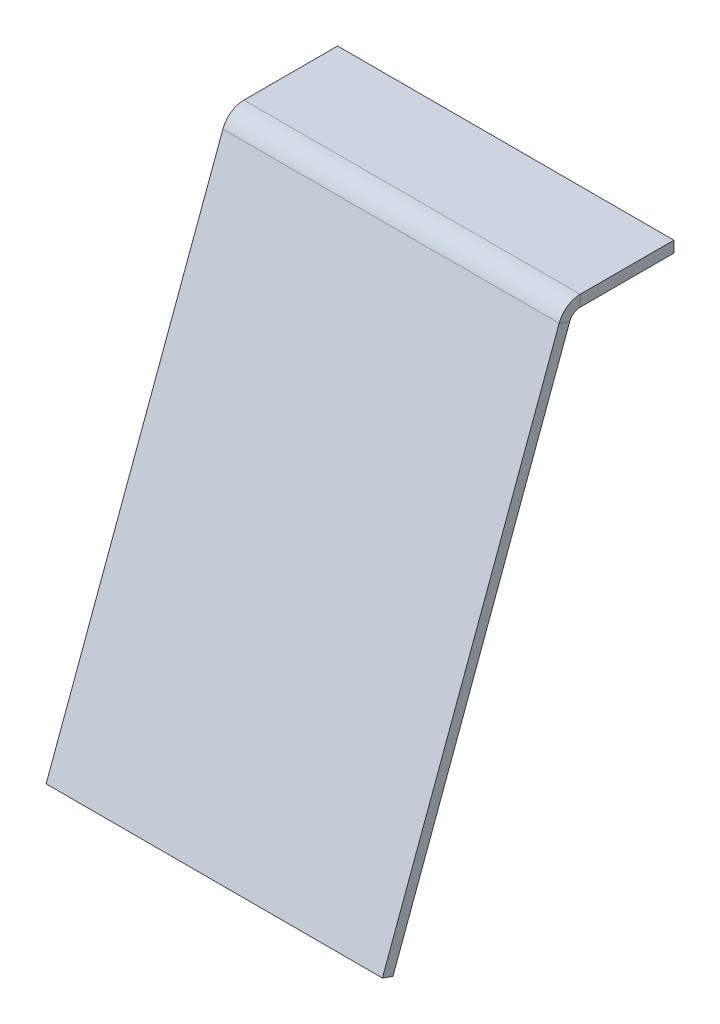
ISO-10303-21;
HEADER;
FILE_DESCRIPTION(('STEP AP214'),'2;1');
FILE_NAME('part.step','',(''),(''),'','','');
FILE_SCHEMA(('AUTOMOTIVE_DESIGN { 1 0 10303 214 1 1 1 1 }'));
ENDSEC;
DATA;
#1=APPLICATION_CONTEXT('core data for automotive mechanical design processes');
#2=APPLICATION_PROTOCOL_DEFINITION('international standard','automotive_design',2000,#1);
#3=PRODUCT_CONTEXT('',#1,'mechanical');
#4=PRODUCT('Part','Part','',(#3));
#5=PRODUCT_RELATED_PRODUCT_CATEGORY('part','',(#4));
#6=PRODUCT_DEFINITION_FORMATION('','',#4);
#7=PRODUCT_DEFINITION_CONTEXT('part definition',#1,'design');
#8=PRODUCT_DEFINITION('design','',#6,#7);
#9=PRODUCT_DEFINITION_SHAPE('','',#8);
#10=(LENGTH_UNIT() NAMED_UNIT(*) SI_UNIT(.MILLI.,.METRE.));
#11=(NAMED_UNIT(*) PLANE_ANGLE_UNIT() SI_UNIT($,.RADIAN.));
#12=(NAMED_UNIT(*) SI_UNIT($,.STERADIAN.) SOLID_ANGLE_UNIT());
#13=UNCERTAINTY_MEASURE_WITH_UNIT(LENGTH_MEASURE(1.E-05),#10,'distance_accuracy_value','');
#14=(GEOMETRIC_REPRESENTATION_CONTEXT(3) GLOBAL_UNCERTAINTY_ASSIGNED_CONTEXT((#13)) GLOBAL_UNIT_ASSIGNED_CONTEXT((#10,
#11,#12)) REPRESENTATION_CONTEXT('',''));
#15=CARTESIAN_POINT('',(0.,0.,0.));
#16=DIRECTION('',(0.,0.,1.));
#17=DIRECTION('',(1.,0.,0.));
#18=AXIS2_PLACEMENT_3D('',#15,#16,#17);
#19=CARTESIAN_POINT('',(95.25,417.390272266095,-519.223647402558));
#20=DIRECTION('',(0.,0.938069827203817,-0.346446243001423));
#21=DIRECTION('',(0.,0.346446243001423,0.938069827203817));
#22=AXIS2_PLACEMENT_3D('',#19,#20,#21);
#23=PLANE('',#22);
#24=DIRECTION('',(0.,0.346446243001423,0.938069827203817));
#25=VECTOR('',#24,1.);
#26=CARTESIAN_POINT('',(95.25,417.390272266095,-519.223647402558));
#27=LINE('',#26,#25);
#28=CARTESIAN_POINT('',(95.25,655.025066356945,124.218256597256));
#29=VERTEX_POINT('',#28);
#30=CARTESIAN_POINT('',(95.25,657.225000000004,130.175));
#31=VERTEX_POINT('',#30);
#32=EDGE_CURVE('E168',#29,#31,#27,.T.);
#33=ORIENTED_EDGE('',*,*,#32,.T.);
#34=DIRECTION('',(-1.,0.,0.));
#35=VECTOR('',#34,1.);
#36=CARTESIAN_POINT('',(95.25,657.225000000004,130.175));
#37=LINE('',#36,#35);
#38=CARTESIAN_POINT('',(-95.25,657.225000000004,130.175));
#39=VERTEX_POINT('',#38);
#40=EDGE_CURVE('E68',#31,#39,#37,.T.);
#41=ORIENTED_EDGE('',*,*,#40,.T.);
#42=DIRECTION('',(0.,0.346446243001423,0.938069827203817));
#43=VECTOR('',#42,1.);
#44=CARTESIAN_POINT('',(-95.25,417.390272266095,-519.223647402558));
#45=LINE('',#44,#43);
#46=CARTESIAN_POINT('',(-95.25,655.025066356945,124.218256597256));
#47=VERTEX_POINT('',#46);
#48=EDGE_CURVE('E157',#47,#39,#45,.T.);
#49=ORIENTED_EDGE('',*,*,#48,.F.);
#50=DIRECTION('',(-1.,0.,0.));
#51=VECTOR('',#50,1.);
#52=CARTESIAN_POINT('',(95.25,655.025066356945,124.218256597256));
#53=LINE('',#52,#51);
#54=EDGE_CURVE('E11',#29,#47,#53,.T.);
#55=ORIENTED_EDGE('',*,*,#54,.F.);
#56=EDGE_LOOP('',(#33,#41,#49,#55));
#57=FACE_BOUND('',#56,.T.);
#58=ADVANCED_FACE('F36',(#57),#23,.F.);
#59=CARTESIAN_POINT('',(95.25,692.640205909143,-620.878452441188));
#60=DIRECTION('',(1.,0.,0.));
#61=DIRECTION('',(0.,0.938069827203817,-0.346446243001423));
#62=AXIS2_PLACEMENT_3D('',#59,#60,#61);
#63=PLANE('',#62);
#64=DIRECTION('',(0.,-0.938069827203817,0.346446243001423));
#65=VECTOR('',#64,1.);
#66=CARTESIAN_POINT('',(95.25,657.225000000004,130.175));
#67=LINE('',#66,#65);
#68=CARTESIAN_POINT('',(95.25,928.324867286111,30.052889922741));
#69=VERTEX_POINT('',#68);
#70=EDGE_CURVE('E166',#69,#31,#67,.T.);
#71=ORIENTED_EDGE('',*,*,#70,.T.);
#72=ORIENTED_EDGE('',*,*,#32,.F.);
#73=DIRECTION('',(0.,0.938069827203817,-0.346446243001423));
#74=VECTOR('',#73,1.);
#75=CARTESIAN_POINT('',(95.25,930.274999999993,22.5634515586263));
#76=LINE('',#75,#74);
#77=CARTESIAN_POINT('',(95.25,926.124933643052,24.0961465199965));
#78=VERTEX_POINT('',#77);
#79=EDGE_CURVE('E163',#29,#78,#76,.T.);
#80=ORIENTED_EDGE('',*,*,#79,.T.);
#81=DIRECTION('',(0.,0.346446243001423,0.938069827203817));
#82=VECTOR('',#81,1.);
#83=CARTESIAN_POINT('',(95.25,688.490139552202,-619.345757479818));
#84=LINE('',#83,#82);
#85=EDGE_CURVE('E137',#78,#69,#84,.T.);
#86=ORIENTED_EDGE('',*,*,#85,.T.);
#87=EDGE_LOOP('',(#71,#72,#80,#86));
#88=FACE_BOUND('',#87,.T.);
#89=ADVANCED_FACE('F215',(#88),#63,.T.);
#90=CARTESIAN_POINT('',(95.25,657.225000000004,130.175));
#91=DIRECTION('',(0.,-0.346446243001423,-0.938069827203817));
#92=DIRECTION('',(0.,0.938069827203817,-0.346446243001423));
#93=AXIS2_PLACEMENT_3D('',#90,#91,#92);
#94=PLANE('',#93);
#95=ORIENTED_EDGE('',*,*,#70,.F.);
#96=DIRECTION('',(-1.,0.,0.));
#97=VECTOR('',#96,1.);
#98=CARTESIAN_POINT('',(95.25,928.324867286111,30.0528899227407));
#99=LINE('',#98,#97);
#100=CARTESIAN_POINT('',(-95.25,928.324867286111,30.052889922741));
#101=VERTEX_POINT('',#100);
#102=EDGE_CURVE('E160',#69,#101,#99,.T.);
#103=ORIENTED_EDGE('',*,*,#102,.T.);
#104=DIRECTION('',(0.,0.938069827203817,-0.346446243001423));
#105=VECTOR('',#104,1.);
#106=CARTESIAN_POINT('',(-95.25,932.474933643052,28.5201949613704));
#107=LINE('',#106,#105);
#108=EDGE_CURVE('E72',#39,#101,#107,.T.);
#109=ORIENTED_EDGE('',*,*,#108,.F.);
#110=ORIENTED_EDGE('',*,*,#40,.F.);
#111=EDGE_LOOP('',(#95,#103,#109,#110));
#112=FACE_BOUND('',#111,.T.);
#113=ADVANCED_FACE('F182',(#112),#94,.F.);
#114=CARTESIAN_POINT('',(-95.25,692.640205909143,-620.878452441188));
#115=DIRECTION('',(1.,0.,0.));
#116=DIRECTION('',(0.,0.938069827203817,-0.346446243001423));
#117=AXIS2_PLACEMENT_3D('',#114,#115,#116);
#118=PLANE('',#117);
#119=ORIENTED_EDGE('',*,*,#48,.T.);
#120=ORIENTED_EDGE('',*,*,#108,.T.);
#121=DIRECTION('',(0.,0.346446243001423,0.938069827203817));
#122=VECTOR('',#121,1.);
#123=CARTESIAN_POINT('',(-95.25,688.490139552202,-619.345757479818));
#124=LINE('',#123,#122);
#125=CARTESIAN_POINT('',(-95.2499999999999,926.124933643052,24.0961465199965));
#126=VERTEX_POINT('',#125);
#127=EDGE_CURVE('E40',#126,#101,#124,.T.);
#128=ORIENTED_EDGE('',*,*,#127,.F.);
#129=DIRECTION('',(0.,0.938069827203817,-0.346446243001423));
#130=VECTOR('',#129,1.);
#131=CARTESIAN_POINT('',(-95.25,930.274999999993,22.5634515586263));
#132=LINE('',#131,#130);
#133=EDGE_CURVE('E154',#47,#126,#132,.T.);
#134=ORIENTED_EDGE('',*,*,#133,.F.);
#135=EDGE_LOOP('',(#119,#120,#128,#134));
#136=FACE_BOUND('',#135,.T.);
#137=ADVANCED_FACE('F180',(#136),#118,.F.);
#138=CARTESIAN_POINT('',(95.25,930.274999999993,22.5634515586263));
#139=DIRECTION('',(0.,0.346446243001423,0.938069827203817));
#140=DIRECTION('',(0.,-0.938069827203817,0.346446243001423));
#141=AXIS2_PLACEMENT_3D('',#138,#139,#140);
#142=PLANE('',#141);
#143=ORIENTED_EDGE('',*,*,#133,.T.);
#144=DIRECTION('',(1.,0.,0.));
#145=VECTOR('',#144,1.);
#146=CARTESIAN_POINT('',(95.25,926.124933643052,24.0961465199965));
#147=LINE('',#146,#145);
#148=EDGE_CURVE('E46',#126,#78,#147,.T.);
#149=ORIENTED_EDGE('',*,*,#148,.T.);
#150=ORIENTED_EDGE('',*,*,#79,.F.);
#151=ORIENTED_EDGE('',*,*,#54,.T.);
#152=EDGE_LOOP('',(#143,#149,#150,#151));
#153=FACE_BOUND('',#152,.T.);
#154=ADVANCED_FACE('F38',(#153),#142,.F.);
#155=CARTESIAN_POINT('',(95.25,541.119850207021,22.5634515586261));
#156=DIRECTION('',(1.,0.,0.));
#157=DIRECTION('',(0.,0.,-1.));
#158=AXIS2_PLACEMENT_3D('',#155,#156,#157);
#159=PLANE('',#158);
#160=DIRECTION('',(0.,0.,1.));
#161=VECTOR('',#160,1.);
#162=CARTESIAN_POINT('',(95.25,936.624999999993,-34.925));
#163=LINE('',#162,#161);
#164=CARTESIAN_POINT('',(95.25,936.624999999993,-34.925));
#165=VERTEX_POINT('',#164);
#166=CARTESIAN_POINT('',(95.25,936.624999999993,18.1394031172522));
#167=VERTEX_POINT('',#166);
#168=EDGE_CURVE('E79',#165,#167,#163,.T.);
#169=ORIENTED_EDGE('',*,*,#168,.T.);
#170=DIRECTION('',(0.,1.,0.));
#171=VECTOR('',#170,1.);
#172=CARTESIAN_POINT('',(95.25,541.119850207021,18.1394031172522));
#173=LINE('',#172,#171);
#174=CARTESIAN_POINT('',(95.25,930.274999999993,18.1394031172522));
#175=VERTEX_POINT('',#174);
#176=EDGE_CURVE('E115',#175,#167,#173,.T.);
#177=ORIENTED_EDGE('',*,*,#176,.F.);
#178=DIRECTION('',(0.,0.,-1.));
#179=VECTOR('',#178,1.);
#180=CARTESIAN_POINT('',(95.25,930.274999999993,22.5634515586261));
#181=LINE('',#180,#179);
#182=CARTESIAN_POINT('',(95.25,930.274999999993,-34.925));
#183=VERTEX_POINT('',#182);
#184=EDGE_CURVE('E118',#175,#183,#181,.T.);
#185=ORIENTED_EDGE('',*,*,#184,.T.);
#186=DIRECTION('',(0.,1.,0.));
#187=VECTOR('',#186,1.);
#188=CARTESIAN_POINT('',(95.25,541.119850207021,-34.925));
#189=LINE('',#188,#187);
#190=EDGE_CURVE('E145',#183,#165,#189,.T.);
#191=ORIENTED_EDGE('',*,*,#190,.T.);
#192=EDGE_LOOP('',(#169,#177,#185,#191));
#193=FACE_BOUND('',#192,.T.);
#194=ADVANCED_FACE('F117',(#193),#159,.T.);
#195=CARTESIAN_POINT('',(-95.25,541.119850207021,22.5634515586261));
#196=DIRECTION('',(1.,0.,0.));
#197=DIRECTION('',(0.,0.,-1.));
#198=AXIS2_PLACEMENT_3D('',#195,#196,#197);
#199=PLANE('',#198);
#200=DIRECTION('',(0.,1.,0.));
#201=VECTOR('',#200,1.);
#202=CARTESIAN_POINT('',(-95.25,541.119850207021,18.1394031172522));
#203=LINE('',#202,#201);
#204=CARTESIAN_POINT('',(-95.25,930.274999999993,18.1394031172522));
#205=VERTEX_POINT('',#204);
#206=CARTESIAN_POINT('',(-95.25,936.624999999993,18.1394031172522));
#207=VERTEX_POINT('',#206);
#208=EDGE_CURVE('E87',#205,#207,#203,.T.);
#209=ORIENTED_EDGE('',*,*,#208,.T.);
#210=DIRECTION('',(0.,0.,1.));
#211=VECTOR('',#210,1.);
#212=CARTESIAN_POINT('',(-95.25,936.624999999993,-34.925));
#213=LINE('',#212,#211);
#214=CARTESIAN_POINT('',(-95.25,936.624999999993,-34.925));
#215=VERTEX_POINT('',#214);
#216=EDGE_CURVE('E187',#215,#207,#213,.T.);
#217=ORIENTED_EDGE('',*,*,#216,.F.);
#218=DIRECTION('',(0.,1.,0.));
#219=VECTOR('',#218,1.);
#220=CARTESIAN_POINT('',(-95.25,541.119850207021,-34.925));
#221=LINE('',#220,#219);
#222=CARTESIAN_POINT('',(-95.25,930.274999999993,-34.925));
#223=VERTEX_POINT('',#222);
#224=EDGE_CURVE('E147',#223,#215,#221,.T.);
#225=ORIENTED_EDGE('',*,*,#224,.F.);
#226=DIRECTION('',(0.,0.,-1.));
#227=VECTOR('',#226,1.);
#228=CARTESIAN_POINT('',(-95.25,930.274999999993,22.5634515586261));
#229=LINE('',#228,#227);
#230=EDGE_CURVE('E198',#205,#223,#229,.T.);
#231=ORIENTED_EDGE('',*,*,#230,.F.);
#232=EDGE_LOOP('',(#209,#217,#225,#231));
#233=FACE_BOUND('',#232,.T.);
#234=ADVANCED_FACE('F202',(#233),#199,.F.);
#235=CARTESIAN_POINT('',(95.25,541.119850207021,-34.925));
#236=DIRECTION('',(0.,0.,-1.));
#237=DIRECTION('',(-1.,0.,0.));
#238=AXIS2_PLACEMENT_3D('',#235,#236,#237);
#239=PLANE('',#238);
#240=DIRECTION('',(-1.,0.,0.));
#241=VECTOR('',#240,1.);
#242=CARTESIAN_POINT('',(95.25,936.624999999993,-34.925));
#243=LINE('',#242,#241);
#244=EDGE_CURVE('E193',#165,#215,#243,.T.);
#245=ORIENTED_EDGE('',*,*,#244,.F.);
#246=ORIENTED_EDGE('',*,*,#190,.F.);
#247=DIRECTION('',(-1.,0.,0.));
#248=VECTOR('',#247,1.);
#249=CARTESIAN_POINT('',(95.25,930.274999999993,-34.925));
#250=LINE('',#249,#248);
#251=EDGE_CURVE('E131',#183,#223,#250,.T.);
#252=ORIENTED_EDGE('',*,*,#251,.T.);
#253=ORIENTED_EDGE('',*,*,#224,.T.);
#254=EDGE_LOOP('',(#245,#246,#252,#253));
#255=FACE_BOUND('',#254,.T.);
#256=ADVANCED_FACE('F201',(#255),#239,.T.);
#257=CARTESIAN_POINT('',(95.25,930.274999999993,22.5634515586261));
#258=DIRECTION('',(0.,1.,0.));
#259=DIRECTION('',(0.,0.,1.));
#260=AXIS2_PLACEMENT_3D('',#257,#258,#259);
#261=PLANE('',#260);
#262=DIRECTION('',(1.,0.,0.));
#263=VECTOR('',#262,1.);
#264=CARTESIAN_POINT('',(95.25,930.274999999993,18.1394031172522));
#265=LINE('',#264,#263);
#266=EDGE_CURVE('E130',#205,#175,#265,.T.);
#267=ORIENTED_EDGE('',*,*,#266,.F.);
#268=ORIENTED_EDGE('',*,*,#230,.T.);
#269=ORIENTED_EDGE('',*,*,#251,.F.);
#270=ORIENTED_EDGE('',*,*,#184,.F.);
#271=EDGE_LOOP('',(#267,#268,#269,#270));
#272=FACE_BOUND('',#271,.T.);
#273=ADVANCED_FACE('F127',(#272),#261,.F.);
#274=CARTESIAN_POINT('',(95.25,936.624999999993,-34.925));
#275=DIRECTION('',(0.,-1.,0.));
#276=DIRECTION('',(0.,0.,-1.));
#277=AXIS2_PLACEMENT_3D('',#274,#275,#276);
#278=PLANE('',#277);
#279=DIRECTION('',(-1.,0.,0.));
#280=VECTOR('',#279,1.);
#281=CARTESIAN_POINT('',(95.25,936.624999999993,18.1394031172522));
#282=LINE('',#281,#280);
#283=EDGE_CURVE('E196',#167,#207,#282,.T.);
#284=ORIENTED_EDGE('',*,*,#283,.F.);
#285=ORIENTED_EDGE('',*,*,#168,.F.);
#286=ORIENTED_EDGE('',*,*,#244,.T.);
#287=ORIENTED_EDGE('',*,*,#216,.T.);
#288=EDGE_LOOP('',(#284,#285,#286,#287));
#289=FACE_BOUND('',#288,.T.);
#290=ADVANCED_FACE('F204',(#289),#278,.F.);
#291=CARTESIAN_POINT('',(95.25,923.924999999993,18.1394031172522));
#292=DIRECTION('',(1.,0.,0.));
#293=DIRECTION('',(0.,0.,-1.));
#294=AXIS2_PLACEMENT_3D('',#291,#292,#293);
#295=PLANE('',#294);
#296=ORIENTED_EDGE('',*,*,#85,.F.);
#297=CARTESIAN_POINT('',(95.25,923.924999999993,18.1394031172522));
#298=DIRECTION('',(-1.,0.,0.));
#299=DIRECTION('',(0.,0.,1.));
#300=AXIS2_PLACEMENT_3D('',#297,#298,#299);
#301=CIRCLE('',#300,6.35000000000004);
#302=EDGE_CURVE('E134',#78,#175,#301,.T.);
#303=ORIENTED_EDGE('',*,*,#302,.T.);
#304=ORIENTED_EDGE('',*,*,#176,.T.);
#305=CARTESIAN_POINT('',(95.25,923.924999999993,18.1394031172522));
#306=DIRECTION('',(-1.,0.,0.));
#307=DIRECTION('',(0.,0.,1.));
#308=AXIS2_PLACEMENT_3D('',#305,#306,#307);
#309=CIRCLE('',#308,12.7000000000003);
#310=EDGE_CURVE('E185',#69,#167,#309,.T.);
#311=ORIENTED_EDGE('',*,*,#310,.F.);
#312=EDGE_LOOP('',(#296,#303,#304,#311));
#313=FACE_BOUND('',#312,.T.);
#314=ADVANCED_FACE('F135',(#313),#295,.T.);
#315=CARTESIAN_POINT('',(-95.2499999999999,923.924999999993,18.1394031172522));
#316=DIRECTION('',(-1.,0.,0.));
#317=DIRECTION('',(0.,0.,1.));
#318=AXIS2_PLACEMENT_3D('',#315,#316,#317);
#319=PLANE('',#318);
#320=CARTESIAN_POINT('',(-95.2499999999999,923.924999999993,18.1394031172522));
#321=DIRECTION('',(-1.,0.,0.));
#322=DIRECTION('',(0.,0.,1.));
#323=AXIS2_PLACEMENT_3D('',#320,#321,#322);
#324=CIRCLE('',#323,6.35000000000004);
#325=EDGE_CURVE('E140',#205,#126,#324,.F.);
#326=ORIENTED_EDGE('',*,*,#325,.T.);
#327=ORIENTED_EDGE('',*,*,#127,.T.);
#328=CARTESIAN_POINT('',(-95.2499999999999,923.924999999993,18.1394031172522));
#329=DIRECTION('',(-1.,0.,0.));
#330=DIRECTION('',(0.,0.,1.));
#331=AXIS2_PLACEMENT_3D('',#328,#329,#330);
#332=CIRCLE('',#331,12.7000000000003);
#333=EDGE_CURVE('E177',#207,#101,#332,.F.);
#334=ORIENTED_EDGE('',*,*,#333,.F.);
#335=ORIENTED_EDGE('',*,*,#208,.F.);
#336=EDGE_LOOP('',(#326,#327,#334,#335));
#337=FACE_BOUND('',#336,.T.);
#338=ADVANCED_FACE('F176',(#337),#319,.T.);
#339=CARTESIAN_POINT('',(496.046271422761,923.924999999993,18.1394031172522));
#340=DIRECTION('',(-1.,0.,0.));
#341=DIRECTION('',(0.,0.,1.));
#342=AXIS2_PLACEMENT_3D('',#339,#340,#341);
#343=CYLINDRICAL_SURFACE('',#342,12.7000000000003);
#344=ORIENTED_EDGE('',*,*,#283,.T.);
#345=ORIENTED_EDGE('',*,*,#333,.T.);
#346=ORIENTED_EDGE('',*,*,#102,.F.);
#347=ORIENTED_EDGE('',*,*,#310,.T.);
#348=EDGE_LOOP('',(#344,#345,#346,#347));
#349=FACE_BOUND('',#348,.T.);
#350=ADVANCED_FACE('F184',(#349),#343,.T.);
#351=CARTESIAN_POINT('',(496.046271422761,923.924999999993,18.1394031172522));
#352=DIRECTION('',(-1.,0.,0.));
#353=DIRECTION('',(0.,0.,1.));
#354=AXIS2_PLACEMENT_3D('',#351,#352,#353);
#355=CYLINDRICAL_SURFACE('',#354,6.35000000000004);
#356=ORIENTED_EDGE('',*,*,#266,.T.);
#357=ORIENTED_EDGE('',*,*,#302,.F.);
#358=ORIENTED_EDGE('',*,*,#148,.F.);
#359=ORIENTED_EDGE('',*,*,#325,.F.);
#360=EDGE_LOOP('',(#356,#357,#358,#359));
#361=FACE_BOUND('',#360,.T.);
#362=ADVANCED_FACE('F143',(#361),#355,.F.);
#363=CLOSED_SHELL('',(#58,#89,#113,#137,#154,#194,#234,#256,#273,#290,#314,#338,#350,#362));
#364=MANIFOLD_SOLID_BREP('B2',#363);
#365=ADVANCED_BREP_SHAPE_REPRESENTATION('',(#18,#364),#14);
#366=SHAPE_DEFINITION_REPRESENTATION(#9,#365);
ENDSEC;
END-ISO-10303-21;
